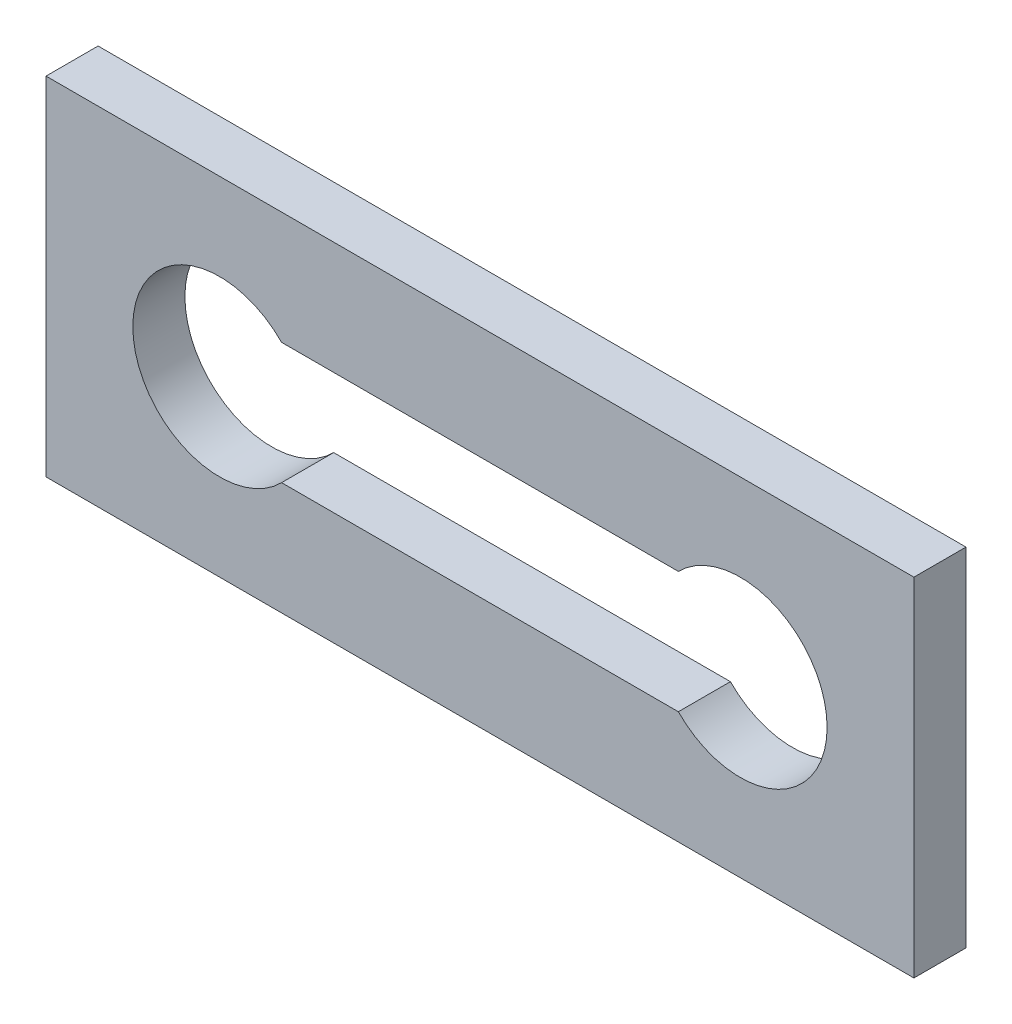
ISO-10303-21;
HEADER;
FILE_DESCRIPTION(('STEP AP214'),'2;1');
FILE_NAME('part.step','',(''),(''),'','','');
FILE_SCHEMA(('AUTOMOTIVE_DESIGN { 1 0 10303 214 1 1 1 1 }'));
ENDSEC;
DATA;
#1=APPLICATION_CONTEXT('core data for automotive mechanical design processes');
#2=APPLICATION_PROTOCOL_DEFINITION('international standard','automotive_design',2000,#1);
#3=PRODUCT_CONTEXT('',#1,'mechanical');
#4=PRODUCT('Part','Part','',(#3));
#5=PRODUCT_RELATED_PRODUCT_CATEGORY('part','',(#4));
#6=PRODUCT_DEFINITION_FORMATION('','',#4);
#7=PRODUCT_DEFINITION_CONTEXT('part definition',#1,'design');
#8=PRODUCT_DEFINITION('design','',#6,#7);
#9=PRODUCT_DEFINITION_SHAPE('','',#8);
#10=(LENGTH_UNIT() NAMED_UNIT(*) SI_UNIT(.MILLI.,.METRE.));
#11=(NAMED_UNIT(*) PLANE_ANGLE_UNIT() SI_UNIT($,.RADIAN.));
#12=(NAMED_UNIT(*) SI_UNIT($,.STERADIAN.) SOLID_ANGLE_UNIT());
#13=UNCERTAINTY_MEASURE_WITH_UNIT(LENGTH_MEASURE(1.E-05),#10,'distance_accuracy_value','');
#14=(GEOMETRIC_REPRESENTATION_CONTEXT(3) GLOBAL_UNCERTAINTY_ASSIGNED_CONTEXT((#13)) GLOBAL_UNIT_ASSIGNED_CONTEXT((#10,
#11,#12)) REPRESENTATION_CONTEXT('',''));
#15=CARTESIAN_POINT('',(0.,0.,0.));
#16=DIRECTION('',(0.,0.,1.));
#17=DIRECTION('',(1.,0.,0.));
#18=AXIS2_PLACEMENT_3D('',#15,#16,#17);
#19=CARTESIAN_POINT('',(0.,0.,3.));
#20=DIRECTION('',(0.,0.,1.));
#21=DIRECTION('',(1.,0.,0.));
#22=AXIS2_PLACEMENT_3D('',#19,#20,#21);
#23=PLANE('',#22);
#24=DIRECTION('',(1.,0.,0.));
#25=VECTOR('',#24,1.);
#26=CARTESIAN_POINT('',(-25.,10.,3.));
#27=LINE('',#26,#25);
#28=CARTESIAN_POINT('',(-25.,10.,3.));
#29=VERTEX_POINT('',#28);
#30=CARTESIAN_POINT('',(25.,10.,3.));
#31=VERTEX_POINT('',#30);
#32=EDGE_CURVE('E184',#29,#31,#27,.T.);
#33=ORIENTED_EDGE('',*,*,#32,.F.);
#34=DIRECTION('',(0.,1.,0.));
#35=VECTOR('',#34,1.);
#36=CARTESIAN_POINT('',(-25.,-10.,3.));
#37=LINE('',#36,#35);
#38=CARTESIAN_POINT('',(-25.,-10.,3.));
#39=VERTEX_POINT('',#38);
#40=EDGE_CURVE('E195',#39,#29,#37,.T.);
#41=ORIENTED_EDGE('',*,*,#40,.F.);
#42=DIRECTION('',(1.,0.,0.));
#43=VECTOR('',#42,1.);
#44=CARTESIAN_POINT('',(-25.,-10.,3.));
#45=LINE('',#44,#43);
#46=CARTESIAN_POINT('',(25.,-10.,3.));
#47=VERTEX_POINT('',#46);
#48=EDGE_CURVE('E192',#39,#47,#45,.T.);
#49=ORIENTED_EDGE('',*,*,#48,.T.);
#50=DIRECTION('',(0.,1.,0.));
#51=VECTOR('',#50,1.);
#52=CARTESIAN_POINT('',(25.,-10.,3.));
#53=LINE('',#52,#51);
#54=EDGE_CURVE('E188',#47,#31,#53,.T.);
#55=ORIENTED_EDGE('',*,*,#54,.T.);
#56=EDGE_LOOP('',(#33,#41,#49,#55));
#57=FACE_BOUND('',#56,.T.);
#58=CARTESIAN_POINT('',(-15.,0.,3.));
#59=DIRECTION('',(0.,0.,1.));
#60=DIRECTION('',(1.,0.,0.));
#61=AXIS2_PLACEMENT_3D('',#58,#59,#60);
#62=CIRCLE('',#61,5.);
#63=CARTESIAN_POINT('',(-11.4292857857286,3.5,3.));
#64=VERTEX_POINT('',#63);
#65=CARTESIAN_POINT('',(-11.4292857857286,-3.5,3.));
#66=VERTEX_POINT('',#65);
#67=EDGE_CURVE('E87',#64,#66,#62,.T.);
#68=ORIENTED_EDGE('',*,*,#67,.F.);
#69=DIRECTION('',(1.,0.,0.));
#70=VECTOR('',#69,1.);
#71=CARTESIAN_POINT('',(-15.,3.5,3.));
#72=LINE('',#71,#70);
#73=CARTESIAN_POINT('',(11.4292857857286,3.5,3.));
#74=VERTEX_POINT('',#73);
#75=EDGE_CURVE('E148',#64,#74,#72,.T.);
#76=ORIENTED_EDGE('',*,*,#75,.T.);
#77=CARTESIAN_POINT('',(15.,0.,3.));
#78=DIRECTION('',(0.,0.,1.));
#79=DIRECTION('',(1.,0.,0.));
#80=AXIS2_PLACEMENT_3D('',#77,#78,#79);
#81=CIRCLE('',#80,5.);
#82=CARTESIAN_POINT('',(11.4292857857286,-3.5,3.));
#83=VERTEX_POINT('',#82);
#84=EDGE_CURVE('E177',#83,#74,#81,.T.);
#85=ORIENTED_EDGE('',*,*,#84,.F.);
#86=DIRECTION('',(1.,0.,0.));
#87=VECTOR('',#86,1.);
#88=CARTESIAN_POINT('',(-15.,-3.5,3.));
#89=LINE('',#88,#87);
#90=EDGE_CURVE('E155',#66,#83,#89,.T.);
#91=ORIENTED_EDGE('',*,*,#90,.F.);
#92=EDGE_LOOP('',(#68,#76,#85,#91));
#93=FACE_BOUND('',#92,.T.);
#94=ADVANCED_FACE('F69',(#57,#93),#23,.T.);
#95=CARTESIAN_POINT('',(0.,0.,0.));
#96=DIRECTION('',(0.,0.,1.));
#97=DIRECTION('',(1.,0.,0.));
#98=AXIS2_PLACEMENT_3D('',#95,#96,#97);
#99=PLANE('',#98);
#100=DIRECTION('',(1.,0.,0.));
#101=VECTOR('',#100,1.);
#102=CARTESIAN_POINT('',(-25.,10.,0.));
#103=LINE('',#102,#101);
#104=CARTESIAN_POINT('',(-25.,10.,0.));
#105=VERTEX_POINT('',#104);
#106=CARTESIAN_POINT('',(25.,10.,0.));
#107=VERTEX_POINT('',#106);
#108=EDGE_CURVE('E144',#105,#107,#103,.T.);
#109=ORIENTED_EDGE('',*,*,#108,.T.);
#110=DIRECTION('',(0.,1.,0.));
#111=VECTOR('',#110,1.);
#112=CARTESIAN_POINT('',(25.,-10.,0.));
#113=LINE('',#112,#111);
#114=CARTESIAN_POINT('',(25.,-10.,0.));
#115=VERTEX_POINT('',#114);
#116=EDGE_CURVE('E202',#115,#107,#113,.T.);
#117=ORIENTED_EDGE('',*,*,#116,.F.);
#118=DIRECTION('',(1.,0.,0.));
#119=VECTOR('',#118,1.);
#120=CARTESIAN_POINT('',(-25.,-10.,0.));
#121=LINE('',#120,#119);
#122=CARTESIAN_POINT('',(-25.,-10.,0.));
#123=VERTEX_POINT('',#122);
#124=EDGE_CURVE('E206',#123,#115,#121,.T.);
#125=ORIENTED_EDGE('',*,*,#124,.F.);
#126=DIRECTION('',(0.,1.,0.));
#127=VECTOR('',#126,1.);
#128=CARTESIAN_POINT('',(-25.,-10.,0.));
#129=LINE('',#128,#127);
#130=EDGE_CURVE('E189',#123,#105,#129,.T.);
#131=ORIENTED_EDGE('',*,*,#130,.T.);
#132=EDGE_LOOP('',(#109,#117,#125,#131));
#133=FACE_BOUND('',#132,.T.);
#134=DIRECTION('',(1.,0.,0.));
#135=VECTOR('',#134,1.);
#136=CARTESIAN_POINT('',(-15.,3.5,0.));
#137=LINE('',#136,#135);
#138=CARTESIAN_POINT('',(-11.4292857857286,3.5,0.));
#139=VERTEX_POINT('',#138);
#140=CARTESIAN_POINT('',(11.4292857857286,3.5,0.));
#141=VERTEX_POINT('',#140);
#142=EDGE_CURVE('E166',#139,#141,#137,.T.);
#143=ORIENTED_EDGE('',*,*,#142,.F.);
#144=CARTESIAN_POINT('',(-15.,0.,0.));
#145=DIRECTION('',(0.,0.,1.));
#146=DIRECTION('',(1.,0.,0.));
#147=AXIS2_PLACEMENT_3D('',#144,#145,#146);
#148=CIRCLE('',#147,5.);
#149=CARTESIAN_POINT('',(-11.4292857857286,-3.5,0.));
#150=VERTEX_POINT('',#149);
#151=EDGE_CURVE('E140',#139,#150,#148,.T.);
#152=ORIENTED_EDGE('',*,*,#151,.T.);
#153=DIRECTION('',(1.,0.,0.));
#154=VECTOR('',#153,1.);
#155=CARTESIAN_POINT('',(-15.,-3.5,0.));
#156=LINE('',#155,#154);
#157=CARTESIAN_POINT('',(11.4292857857286,-3.5,0.));
#158=VERTEX_POINT('',#157);
#159=EDGE_CURVE('E169',#150,#158,#156,.T.);
#160=ORIENTED_EDGE('',*,*,#159,.T.);
#161=CARTESIAN_POINT('',(15.,0.,0.));
#162=DIRECTION('',(0.,0.,1.));
#163=DIRECTION('',(1.,0.,0.));
#164=AXIS2_PLACEMENT_3D('',#161,#162,#163);
#165=CIRCLE('',#164,5.);
#166=EDGE_CURVE('E95',#158,#141,#165,.T.);
#167=ORIENTED_EDGE('',*,*,#166,.T.);
#168=EDGE_LOOP('',(#143,#152,#160,#167));
#169=FACE_BOUND('',#168,.T.);
#170=ADVANCED_FACE('F228',(#133,#169),#99,.F.);
#171=CARTESIAN_POINT('',(-25.,10.,3.));
#172=DIRECTION('',(0.,1.,0.));
#173=DIRECTION('',(0.,0.,1.));
#174=AXIS2_PLACEMENT_3D('',#171,#172,#173);
#175=PLANE('',#174);
#176=ORIENTED_EDGE('',*,*,#108,.F.);
#177=DIRECTION('',(0.,0.,-1.));
#178=VECTOR('',#177,1.);
#179=CARTESIAN_POINT('',(-25.,10.,3.));
#180=LINE('',#179,#178);
#181=EDGE_CURVE('E12',#29,#105,#180,.T.);
#182=ORIENTED_EDGE('',*,*,#181,.F.);
#183=ORIENTED_EDGE('',*,*,#32,.T.);
#184=DIRECTION('',(0.,0.,-1.));
#185=VECTOR('',#184,1.);
#186=CARTESIAN_POINT('',(25.,10.,3.));
#187=LINE('',#186,#185);
#188=EDGE_CURVE('E73',#31,#107,#187,.T.);
#189=ORIENTED_EDGE('',*,*,#188,.T.);
#190=EDGE_LOOP('',(#176,#182,#183,#189));
#191=FACE_BOUND('',#190,.T.);
#192=ADVANCED_FACE('F71',(#191),#175,.T.);
#193=CARTESIAN_POINT('',(-25.,-10.,3.));
#194=DIRECTION('',(-1.,0.,0.));
#195=DIRECTION('',(0.,0.,1.));
#196=AXIS2_PLACEMENT_3D('',#193,#194,#195);
#197=PLANE('',#196);
#198=ORIENTED_EDGE('',*,*,#130,.F.);
#199=DIRECTION('',(0.,0.,-1.));
#200=VECTOR('',#199,1.);
#201=CARTESIAN_POINT('',(-25.,-10.,3.));
#202=LINE('',#201,#200);
#203=EDGE_CURVE('E79',#39,#123,#202,.T.);
#204=ORIENTED_EDGE('',*,*,#203,.F.);
#205=ORIENTED_EDGE('',*,*,#40,.T.);
#206=ORIENTED_EDGE('',*,*,#181,.T.);
#207=EDGE_LOOP('',(#198,#204,#205,#206));
#208=FACE_BOUND('',#207,.T.);
#209=ADVANCED_FACE('F232',(#208),#197,.T.);
#210=CARTESIAN_POINT('',(-25.,-10.,3.));
#211=DIRECTION('',(0.,1.,0.));
#212=DIRECTION('',(0.,0.,1.));
#213=AXIS2_PLACEMENT_3D('',#210,#211,#212);
#214=PLANE('',#213);
#215=ORIENTED_EDGE('',*,*,#124,.T.);
#216=DIRECTION('',(0.,0.,-1.));
#217=VECTOR('',#216,1.);
#218=CARTESIAN_POINT('',(25.,-10.,3.));
#219=LINE('',#218,#217);
#220=EDGE_CURVE('E213',#47,#115,#219,.T.);
#221=ORIENTED_EDGE('',*,*,#220,.F.);
#222=ORIENTED_EDGE('',*,*,#48,.F.);
#223=ORIENTED_EDGE('',*,*,#203,.T.);
#224=EDGE_LOOP('',(#215,#221,#222,#223));
#225=FACE_BOUND('',#224,.T.);
#226=ADVANCED_FACE('F237',(#225),#214,.F.);
#227=CARTESIAN_POINT('',(25.,-10.,3.));
#228=DIRECTION('',(-1.,0.,0.));
#229=DIRECTION('',(0.,0.,1.));
#230=AXIS2_PLACEMENT_3D('',#227,#228,#229);
#231=PLANE('',#230);
#232=ORIENTED_EDGE('',*,*,#116,.T.);
#233=ORIENTED_EDGE('',*,*,#188,.F.);
#234=ORIENTED_EDGE('',*,*,#54,.F.);
#235=ORIENTED_EDGE('',*,*,#220,.T.);
#236=EDGE_LOOP('',(#232,#233,#234,#235));
#237=FACE_BOUND('',#236,.T.);
#238=ADVANCED_FACE('F225',(#237),#231,.F.);
#239=CARTESIAN_POINT('',(-15.,0.,0.));
#240=DIRECTION('',(0.,0.,1.));
#241=DIRECTION('',(1.,0.,0.));
#242=AXIS2_PLACEMENT_3D('',#239,#240,#241);
#243=CYLINDRICAL_SURFACE('',#242,5.);
#244=ORIENTED_EDGE('',*,*,#67,.T.);
#245=DIRECTION('',(0.,0.,1.));
#246=VECTOR('',#245,1.);
#247=CARTESIAN_POINT('',(-11.4292857857286,-3.5,0.));
#248=LINE('',#247,#246);
#249=EDGE_CURVE('E145',#66,#150,#248,.F.);
#250=ORIENTED_EDGE('',*,*,#249,.T.);
#251=ORIENTED_EDGE('',*,*,#151,.F.);
#252=DIRECTION('',(0.,0.,1.));
#253=VECTOR('',#252,1.);
#254=CARTESIAN_POINT('',(-11.4292857857286,3.5,0.));
#255=LINE('',#254,#253);
#256=EDGE_CURVE('E136',#64,#139,#255,.F.);
#257=ORIENTED_EDGE('',*,*,#256,.F.);
#258=EDGE_LOOP('',(#244,#250,#251,#257));
#259=FACE_BOUND('',#258,.T.);
#260=ADVANCED_FACE('F138',(#259),#243,.F.);
#261=CARTESIAN_POINT('',(15.,0.,0.));
#262=DIRECTION('',(0.,0.,1.));
#263=DIRECTION('',(1.,0.,0.));
#264=AXIS2_PLACEMENT_3D('',#261,#262,#263);
#265=CYLINDRICAL_SURFACE('',#264,5.);
#266=DIRECTION('',(0.,0.,1.));
#267=VECTOR('',#266,1.);
#268=CARTESIAN_POINT('',(11.4292857857286,3.5,0.));
#269=LINE('',#268,#267);
#270=EDGE_CURVE('E150',#74,#141,#269,.F.);
#271=ORIENTED_EDGE('',*,*,#270,.T.);
#272=ORIENTED_EDGE('',*,*,#166,.F.);
#273=DIRECTION('',(0.,0.,1.));
#274=VECTOR('',#273,1.);
#275=CARTESIAN_POINT('',(11.4292857857286,-3.5,0.));
#276=LINE('',#275,#274);
#277=EDGE_CURVE('E163',#83,#158,#276,.F.);
#278=ORIENTED_EDGE('',*,*,#277,.F.);
#279=ORIENTED_EDGE('',*,*,#84,.T.);
#280=EDGE_LOOP('',(#271,#272,#278,#279));
#281=FACE_BOUND('',#280,.T.);
#282=ADVANCED_FACE('F252',(#281),#265,.F.);
#283=CARTESIAN_POINT('',(-15.,3.5,0.));
#284=DIRECTION('',(0.,-1.,0.));
#285=DIRECTION('',(0.,0.,-1.));
#286=AXIS2_PLACEMENT_3D('',#283,#284,#285);
#287=PLANE('',#286);
#288=ORIENTED_EDGE('',*,*,#256,.T.);
#289=ORIENTED_EDGE('',*,*,#142,.T.);
#290=ORIENTED_EDGE('',*,*,#270,.F.);
#291=ORIENTED_EDGE('',*,*,#75,.F.);
#292=EDGE_LOOP('',(#288,#289,#290,#291));
#293=FACE_BOUND('',#292,.T.);
#294=ADVANCED_FACE('F149',(#293),#287,.T.);
#295=CARTESIAN_POINT('',(-15.,-3.5,0.));
#296=DIRECTION('',(0.,-1.,0.));
#297=DIRECTION('',(0.,0.,-1.));
#298=AXIS2_PLACEMENT_3D('',#295,#296,#297);
#299=PLANE('',#298);
#300=ORIENTED_EDGE('',*,*,#90,.T.);
#301=ORIENTED_EDGE('',*,*,#277,.T.);
#302=ORIENTED_EDGE('',*,*,#159,.F.);
#303=ORIENTED_EDGE('',*,*,#249,.F.);
#304=EDGE_LOOP('',(#300,#301,#302,#303));
#305=FACE_BOUND('',#304,.T.);
#306=ADVANCED_FACE('F255',(#305),#299,.F.);
#307=CLOSED_SHELL('',(#94,#170,#192,#209,#226,#238,#260,#282,#294,#306));
#308=MANIFOLD_SOLID_BREP('B2',#307);
#309=ADVANCED_BREP_SHAPE_REPRESENTATION('',(#18,#308),#14);
#310=SHAPE_DEFINITION_REPRESENTATION(#9,#309);
ENDSEC;
END-ISO-10303-21;
